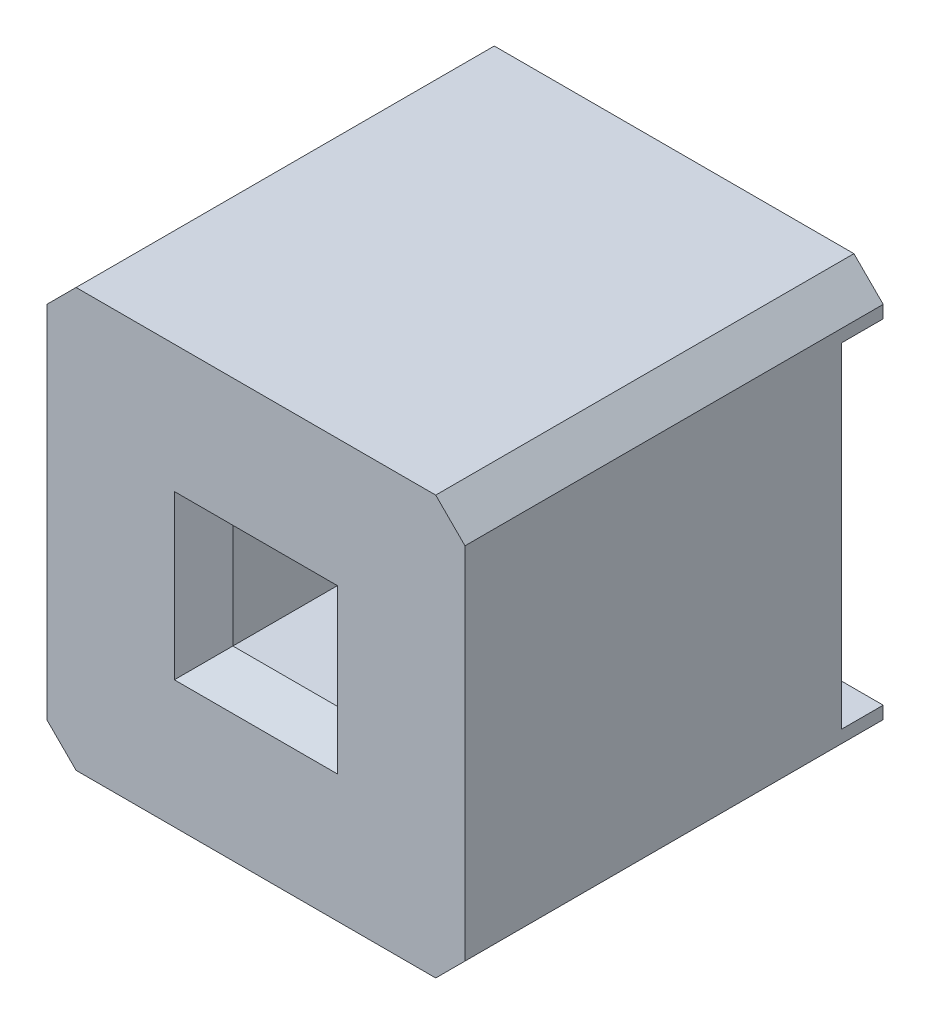
ISO-10303-21;
HEADER;
FILE_DESCRIPTION(('STEP AP214'),'2;1');
FILE_NAME('part.step','',(''),(''),'','','');
FILE_SCHEMA(('AUTOMOTIVE_DESIGN { 1 0 10303 214 1 1 1 1 }'));
ENDSEC;
DATA;
#1=APPLICATION_CONTEXT('core data for automotive mechanical design processes');
#2=APPLICATION_PROTOCOL_DEFINITION('international standard','automotive_design',2000,#1);
#3=PRODUCT_CONTEXT('',#1,'mechanical');
#4=PRODUCT('Part','Part','',(#3));
#5=PRODUCT_RELATED_PRODUCT_CATEGORY('part','',(#4));
#6=PRODUCT_DEFINITION_FORMATION('','',#4);
#7=PRODUCT_DEFINITION_CONTEXT('part definition',#1,'design');
#8=PRODUCT_DEFINITION('design','',#6,#7);
#9=PRODUCT_DEFINITION_SHAPE('','',#8);
#10=(LENGTH_UNIT() NAMED_UNIT(*) SI_UNIT(.MILLI.,.METRE.));
#11=(NAMED_UNIT(*) PLANE_ANGLE_UNIT() SI_UNIT($,.RADIAN.));
#12=(NAMED_UNIT(*) SI_UNIT($,.STERADIAN.) SOLID_ANGLE_UNIT());
#13=UNCERTAINTY_MEASURE_WITH_UNIT(LENGTH_MEASURE(1.E-05),#10,'distance_accuracy_value','');
#14=(GEOMETRIC_REPRESENTATION_CONTEXT(3) GLOBAL_UNCERTAINTY_ASSIGNED_CONTEXT((#13)) GLOBAL_UNIT_ASSIGNED_CONTEXT((#10,
#11,#12)) REPRESENTATION_CONTEXT('',''));
#15=CARTESIAN_POINT('',(0.,0.,0.));
#16=DIRECTION('',(0.,0.,1.));
#17=DIRECTION('',(1.,0.,0.));
#18=AXIS2_PLACEMENT_3D('',#15,#16,#17);
#19=CARTESIAN_POINT('',(63.4364997100133,62.5479954414347,2.30896051788638));
#20=DIRECTION('',(-2.05103367282991E-10,1.,-2.05103428515331E-10));
#21=DIRECTION('',(0.,2.05103428515331E-10,1.));
#22=AXIS2_PLACEMENT_3D('',#19,#20,#21);
#23=PLANE('',#22);
#24=DIRECTION('',(0.,0.,1.));
#25=VECTOR('',#24,1.);
#26=CARTESIAN_POINT('',(63.4364997100133,62.5479954414347,2.30896051801662));
#27=LINE('',#26,#25);
#28=CARTESIAN_POINT('',(63.4364997099546,62.5479954414021,2.30896051791894));
#29=VERTEX_POINT('',#28);
#30=CARTESIAN_POINT('',(63.4364997099245,62.5479954417509,4.41716051787091));
#31=VERTEX_POINT('',#30);
#32=EDGE_CURVE('E170',#29,#31,#27,.T.);
#33=ORIENTED_EDGE('',*,*,#32,.T.);
#34=DIRECTION('',(1.,2.05103367282991E-10,0.));
#35=VECTOR('',#34,1.);
#36=CARTESIAN_POINT('',(63.4364997100133,62.5479954418671,4.41716051788638));
#37=LINE('',#36,#35);
#38=CARTESIAN_POINT('',(62.8014997100426,62.5479954417515,4.41716051791894));
#39=VERTEX_POINT('',#38);
#40=EDGE_CURVE('E20',#39,#31,#37,.T.);
#41=ORIENTED_EDGE('',*,*,#40,.F.);
#42=DIRECTION('',(0.,0.,1.));
#43=VECTOR('',#42,1.);
#44=CARTESIAN_POINT('',(62.8014997100133,62.5479954417368,2.30896051788638));
#45=LINE('',#44,#43);
#46=CARTESIAN_POINT('',(62.8014997100459,62.5479954414125,2.30896051788638));
#47=VERTEX_POINT('',#46);
#48=EDGE_CURVE('E155',#39,#47,#45,.F.);
#49=ORIENTED_EDGE('',*,*,#48,.T.);
#50=DIRECTION('',(1.,2.05103367282991E-10,0.));
#51=VECTOR('',#50,1.);
#52=CARTESIAN_POINT('',(63.4364997100133,62.5479954414347,2.30896051788638));
#53=LINE('',#52,#51);
#54=EDGE_CURVE('E138',#29,#47,#53,.F.);
#55=ORIENTED_EDGE('',*,*,#54,.F.);
#56=EDGE_LOOP('',(#33,#41,#49,#55));
#57=FACE_BOUND('',#56,.T.);
#58=ADVANCED_FACE('F17',(#57),#23,.F.);
#59=CARTESIAN_POINT('',(62.8014997100133,62.5479954413044,2.30896051788638));
#60=DIRECTION('',(-1.,-2.05103367282991E-10,0.));
#61=DIRECTION('',(2.05103367282991E-10,-1.,0.));
#62=AXIS2_PLACEMENT_3D('',#59,#60,#61);
#63=PLANE('',#62);
#64=ORIENTED_EDGE('',*,*,#48,.F.);
#65=DIRECTION('',(2.05103367282991E-10,-1.,0.));
#66=VECTOR('',#65,1.);
#67=CARTESIAN_POINT('',(62.8014997100133,62.5479954413044,4.41716051801662));
#68=LINE('',#67,#66);
#69=CARTESIAN_POINT('',(62.8014997101443,61.9129954415434,4.41716051800847));
#70=VERTEX_POINT('',#69);
#71=EDGE_CURVE('E143',#70,#39,#68,.F.);
#72=ORIENTED_EDGE('',*,*,#71,.F.);
#73=DIRECTION('',(0.,-2.05103428515331E-10,-1.));
#74=VECTOR('',#73,1.);
#75=CARTESIAN_POINT('',(62.8014997101435,61.9129954413044,2.30896051801662));
#76=LINE('',#75,#74);
#77=CARTESIAN_POINT('',(62.8014997101435,61.912995441337,2.3089605179515));
#78=VERTEX_POINT('',#77);
#79=EDGE_CURVE('E194',#70,#78,#76,.T.);
#80=ORIENTED_EDGE('',*,*,#79,.T.);
#81=DIRECTION('',(2.05103367282991E-10,-1.,0.));
#82=VECTOR('',#81,1.);
#83=CARTESIAN_POINT('',(62.8014997100133,62.5479954413044,2.30896051788638));
#84=LINE('',#83,#82);
#85=EDGE_CURVE('E173',#47,#78,#84,.T.);
#86=ORIENTED_EDGE('',*,*,#85,.F.);
#87=EDGE_LOOP('',(#64,#72,#80,#86));
#88=FACE_BOUND('',#87,.T.);
#89=ADVANCED_FACE('F172',(#88),#63,.F.);
#90=CARTESIAN_POINT('',(61.8489997102868,61.214495441057,2.05496051815989));
#91=DIRECTION('',(2.05103367282991E-10,-1.,2.05103428515331E-10));
#92=DIRECTION('',(0.,-2.05103428515331E-10,-1.));
#93=AXIS2_PLACEMENT_3D('',#90,#91,#92);
#94=PLANE('',#93);
#95=DIRECTION('',(0.,-2.05103428515331E-10,-1.));
#96=VECTOR('',#95,1.);
#97=CARTESIAN_POINT('',(64.3889997102868,61.214495441578,2.05496051815989));
#98=LINE('',#97,#96);
#99=CARTESIAN_POINT('',(64.3889997102907,61.2144954416065,2.0549605181677));
#100=VERTEX_POINT('',#99);
#101=CARTESIAN_POINT('',(64.3889997102868,61.2144954415058,2.30896051815989));
#102=VERTEX_POINT('',#101);
#103=EDGE_CURVE('E179',#100,#102,#98,.F.);
#104=ORIENTED_EDGE('',*,*,#103,.F.);
#105=DIRECTION('',(1.,0.,0.));
#106=VECTOR('',#105,1.);
#107=CARTESIAN_POINT('',(64.3889997103389,61.214495441616,2.05496051815988));
#108=LINE('',#107,#106);
#109=CARTESIAN_POINT('',(61.8489997102868,61.2144954412419,2.05496051815989));
#110=VERTEX_POINT('',#109);
#111=EDGE_CURVE('E188',#100,#110,#108,.F.);
#112=ORIENTED_EDGE('',*,*,#111,.T.);
#113=DIRECTION('',(0.,-2.05103428515331E-10,-1.));
#114=VECTOR('',#113,1.);
#115=CARTESIAN_POINT('',(61.8489997102868,61.214495441057,2.05496051815989));
#116=LINE('',#115,#114);
#117=CARTESIAN_POINT('',(61.8489997101826,61.2144954411282,2.3089605180557));
#118=VERTEX_POINT('',#117);
#119=EDGE_CURVE('E175',#118,#110,#116,.T.);
#120=ORIENTED_EDGE('',*,*,#119,.F.);
#121=DIRECTION('',(1.,0.,0.));
#122=VECTOR('',#121,1.);
#123=CARTESIAN_POINT('',(64.3889997102868,61.2144954411472,2.30896051815989));
#124=LINE('',#123,#122);
#125=EDGE_CURVE('E200',#118,#102,#124,.T.);
#126=ORIENTED_EDGE('',*,*,#125,.T.);
#127=EDGE_LOOP('',(#104,#112,#120,#126));
#128=FACE_BOUND('',#127,.T.);
#129=ADVANCED_FACE('F320',(#128),#94,.F.);
#130=CARTESIAN_POINT('',(63.4364997101435,61.9129954414347,2.30896051801662));
#131=DIRECTION('',(1.,2.05103367282991E-10,0.));
#132=DIRECTION('',(-2.05103367282991E-10,1.,0.));
#133=AXIS2_PLACEMENT_3D('',#130,#131,#132);
#134=PLANE('',#133);
#135=DIRECTION('',(0.,-2.05103428515331E-10,-1.));
#136=VECTOR('',#135,1.);
#137=CARTESIAN_POINT('',(63.4364997101435,61.9129954414346,2.30896051801662));
#138=LINE('',#137,#136);
#139=CARTESIAN_POINT('',(63.436499710111,61.9129954415428,2.30896051801662));
#140=VERTEX_POINT('',#139);
#141=CARTESIAN_POINT('',(63.4364997100816,61.9129954418996,4.41716051790427));
#142=VERTEX_POINT('',#141);
#143=EDGE_CURVE('E191',#140,#142,#138,.F.);
#144=ORIENTED_EDGE('',*,*,#143,.T.);
#145=DIRECTION('',(-2.05103367282991E-10,1.,0.));
#146=VECTOR('',#145,1.);
#147=CARTESIAN_POINT('',(63.4364997101435,61.9129954414347,4.41716051788638));
#148=LINE('',#147,#146);
#149=EDGE_CURVE('E182',#31,#142,#148,.F.);
#150=ORIENTED_EDGE('',*,*,#149,.F.);
#151=ORIENTED_EDGE('',*,*,#32,.F.);
#152=DIRECTION('',(0.,-1.,2.05103428515331E-10));
#153=VECTOR('',#152,1.);
#154=CARTESIAN_POINT('',(63.4364997100133,61.21449544163,2.30896051815989));
#155=LINE('',#154,#153);
#156=EDGE_CURVE('E206',#29,#140,#155,.T.);
#157=ORIENTED_EDGE('',*,*,#156,.T.);
#158=EDGE_LOOP('',(#144,#150,#151,#157));
#159=FACE_BOUND('',#158,.T.);
#160=ADVANCED_FACE('F497',(#159),#134,.F.);
#161=CARTESIAN_POINT('',(64.3889997103389,60.9604954415779,2.05496051821198));
#162=DIRECTION('',(0.,2.05103428515331E-10,1.));
#163=DIRECTION('',(0.,-1.,2.05103428515331E-10));
#164=AXIS2_PLACEMENT_3D('',#161,#162,#163);
#165=PLANE('',#164);
#166=DIRECTION('',(0.,-1.,2.05103428515331E-10));
#167=VECTOR('',#166,1.);
#168=CARTESIAN_POINT('',(64.3889997103024,60.9604954415779,2.05496051821198));
#169=LINE('',#168,#167);
#170=CARTESIAN_POINT('',(64.3889997103675,61.1382954417733,2.05496051817552));
#171=VERTEX_POINT('',#170);
#172=EDGE_CURVE('E186',#171,#100,#169,.F.);
#173=ORIENTED_EDGE('',*,*,#172,.F.);
#174=DIRECTION('',(-0.707106781041518,-0.707106781331578,0.));
#175=VECTOR('',#174,1.);
#176=CARTESIAN_POINT('',(64.2111997103389,60.9604954415415,2.05496051817552));
#177=LINE('',#176,#175);
#178=CARTESIAN_POINT('',(64.2111997101149,60.9604954413174,2.05496051820286));
#179=VERTEX_POINT('',#178);
#180=EDGE_CURVE('E196',#171,#179,#177,.T.);
#181=ORIENTED_EDGE('',*,*,#180,.T.);
#182=DIRECTION('',(1.,2.05103367282991E-10,0.));
#183=VECTOR('',#182,1.);
#184=CARTESIAN_POINT('',(62.0267997103389,60.9604954410934,2.05496051821198));
#185=LINE('',#184,#183);
#186=CARTESIAN_POINT('',(62.0267997102087,60.9604954412237,2.05496051821198));
#187=VERTEX_POINT('',#186);
#188=EDGE_CURVE('E217',#187,#179,#185,.T.);
#189=ORIENTED_EDGE('',*,*,#188,.F.);
#190=DIRECTION('',(-0.707106781331578,0.707106781041518,0.));
#191=VECTOR('',#190,1.);
#192=CARTESIAN_POINT('',(61.8489997103024,61.138295441057,2.05496051821198));
#193=LINE('',#192,#191);
#194=CARTESIAN_POINT('',(61.8489997102946,61.1382954410648,2.05496051818072));
#195=VERTEX_POINT('',#194);
#196=EDGE_CURVE('E209',#187,#195,#193,.T.);
#197=ORIENTED_EDGE('',*,*,#196,.T.);
#198=DIRECTION('',(0.,-1.,2.05103428515331E-10));
#199=VECTOR('',#198,1.);
#200=CARTESIAN_POINT('',(61.8489997102868,60.9604954415779,2.05496051821198));
#201=LINE('',#200,#199);
#202=EDGE_CURVE('E184',#110,#195,#201,.T.);
#203=ORIENTED_EDGE('',*,*,#202,.F.);
#204=ORIENTED_EDGE('',*,*,#111,.F.);
#205=EDGE_LOOP('',(#173,#181,#189,#197,#203,#204));
#206=FACE_BOUND('',#205,.T.);
#207=ADVANCED_FACE('F324',(#206),#165,.F.);
#208=CARTESIAN_POINT('',(62.8014997101435,61.9129954413044,2.30896051801662));
#209=DIRECTION('',(2.05103367282991E-10,-1.,2.05103428515331E-10));
#210=DIRECTION('',(0.,-2.05103428515331E-10,-1.));
#211=AXIS2_PLACEMENT_3D('',#208,#209,#210);
#212=PLANE('',#211);
#213=ORIENTED_EDGE('',*,*,#79,.F.);
#214=DIRECTION('',(1.,1.02551683683563E-10,1.02551683641495E-10));
#215=VECTOR('',#214,1.);
#216=CARTESIAN_POINT('',(63.6202433101435,61.9129954418859,4.41716051803542));
#217=LINE('',#216,#215);
#218=EDGE_CURVE('E226',#142,#70,#217,.F.);
#219=ORIENTED_EDGE('',*,*,#218,.F.);
#220=ORIENTED_EDGE('',*,*,#143,.F.);
#221=DIRECTION('',(1.,0.,0.));
#222=VECTOR('',#221,1.);
#223=CARTESIAN_POINT('',(64.3889997102868,61.9129954414347,2.30896051801663));
#224=LINE('',#223,#222);
#225=EDGE_CURVE('E203',#140,#78,#224,.F.);
#226=ORIENTED_EDGE('',*,*,#225,.T.);
#227=EDGE_LOOP('',(#213,#219,#220,#226));
#228=FACE_BOUND('',#227,.T.);
#229=ADVANCED_FACE('F481',(#228),#212,.F.);
#230=CARTESIAN_POINT('',(64.2111997103389,60.9604954415415,2.05496051821198));
#231=DIRECTION('',(-0.707106781331578,0.707106781041518,-1.45030025147801E-10));
#232=DIRECTION('',(-0.707106781041518,-0.707106781331578,0.));
#233=AXIS2_PLACEMENT_3D('',#230,#231,#232);
#234=PLANE('',#233);
#235=DIRECTION('',(-0.707106781041518,-0.707106781331578,0.));
#236=VECTOR('',#235,1.);
#237=CARTESIAN_POINT('',(64.2111997100784,60.960495441802,4.59496051821198));
#238=LINE('',#237,#236);
#239=CARTESIAN_POINT('',(64.2111997100967,60.9604954418202,4.59496051821198));
#240=VERTEX_POINT('',#239);
#241=CARTESIAN_POINT('',(64.3889997103024,61.1382954420989,4.59496051808174));
#242=VERTEX_POINT('',#241);
#243=EDGE_CURVE('E198',#240,#242,#238,.F.);
#244=ORIENTED_EDGE('',*,*,#243,.F.);
#245=DIRECTION('',(0.,-2.05103428515331E-10,-1.));
#246=VECTOR('',#245,1.);
#247=CARTESIAN_POINT('',(64.2111997103389,60.9604954415414,2.05496051821198));
#248=LINE('',#247,#246);
#249=EDGE_CURVE('E165',#179,#240,#248,.F.);
#250=ORIENTED_EDGE('',*,*,#249,.F.);
#251=ORIENTED_EDGE('',*,*,#180,.F.);
#252=DIRECTION('',(0.,0.,1.));
#253=VECTOR('',#252,1.);
#254=CARTESIAN_POINT('',(64.3889997103024,61.1382954420989,2.05496051817552));
#255=LINE('',#254,#253);
#256=EDGE_CURVE('E234',#242,#171,#255,.F.);
#257=ORIENTED_EDGE('',*,*,#256,.F.);
#258=EDGE_LOOP('',(#244,#250,#251,#257));
#259=FACE_BOUND('',#258,.T.);
#260=ADVANCED_FACE('F315',(#259),#234,.F.);
#261=CARTESIAN_POINT('',(64.3889997102868,61.21449544163,2.30896051815989));
#262=DIRECTION('',(0.,2.05103428515331E-10,1.));
#263=DIRECTION('',(0.,-1.,2.05103428515331E-10));
#264=AXIS2_PLACEMENT_3D('',#261,#262,#263);
#265=PLANE('',#264);
#266=ORIENTED_EDGE('',*,*,#54,.T.);
#267=ORIENTED_EDGE('',*,*,#85,.T.);
#268=ORIENTED_EDGE('',*,*,#225,.F.);
#269=ORIENTED_EDGE('',*,*,#156,.F.);
#270=EDGE_LOOP('',(#266,#267,#268,#269));
#271=FACE_BOUND('',#270,.T.);
#272=DIRECTION('',(-2.05103367282991E-10,1.,0.));
#273=VECTOR('',#272,1.);
#274=CARTESIAN_POINT('',(64.3889997103024,61.1382954415779,2.30896051815989));
#275=LINE('',#274,#273);
#276=CARTESIAN_POINT('',(64.3889997100784,63.2464954415728,2.30896051784731));
#277=VERTEX_POINT('',#276);
#278=EDGE_CURVE('E229',#102,#277,#275,.T.);
#279=ORIENTED_EDGE('',*,*,#278,.F.);
#280=ORIENTED_EDGE('',*,*,#125,.F.);
#281=DIRECTION('',(2.05103367282991E-10,-1.,0.));
#282=VECTOR('',#281,1.);
#283=CARTESIAN_POINT('',(61.8489997098544,63.322695441057,2.30896051774312));
#284=LINE('',#283,#282);
#285=CARTESIAN_POINT('',(61.84899970987,63.2464954411882,2.30896051774312));
#286=VERTEX_POINT('',#285);
#287=EDGE_CURVE('E245',#286,#118,#284,.T.);
#288=ORIENTED_EDGE('',*,*,#287,.F.);
#289=DIRECTION('',(1.,2.05103367282991E-10,0.));
#290=VECTOR('',#289,1.);
#291=CARTESIAN_POINT('',(64.38899970987,63.24649544163,2.30896051774312));
#292=LINE('',#291,#290);
#293=EDGE_CURVE('E237',#286,#277,#292,.T.);
#294=ORIENTED_EDGE('',*,*,#293,.T.);
#295=EDGE_LOOP('',(#279,#280,#288,#294));
#296=FACE_BOUND('',#295,.T.);
#297=ADVANCED_FACE('F331',(#271,#296),#265,.F.);
#298=CARTESIAN_POINT('',(61.8489997103024,61.138295441057,2.05496051817552));
#299=DIRECTION('',(0.707106781041518,0.707106781331578,-1.45030025147801E-10));
#300=DIRECTION('',(-0.707106781331578,0.707106781041518,0.));
#301=AXIS2_PLACEMENT_3D('',#298,#299,#300);
#302=PLANE('',#301);
#303=DIRECTION('',(-0.707106781331578,0.707106781041518,0.));
#304=VECTOR('',#303,1.);
#305=CARTESIAN_POINT('',(61.8489997105629,61.1382954413175,4.59496051817552));
#306=LINE('',#305,#304);
#307=CARTESIAN_POINT('',(61.8489997103207,61.1382954414295,4.59496051817552));
#308=VERTEX_POINT('',#307);
#309=CARTESIAN_POINT('',(62.0267997103389,60.9604954416144,4.59496051819375));
#310=VERTEX_POINT('',#309);
#311=EDGE_CURVE('E212',#308,#310,#306,.F.);
#312=ORIENTED_EDGE('',*,*,#311,.F.);
#313=DIRECTION('',(0.,0.,1.));
#314=VECTOR('',#313,1.);
#315=CARTESIAN_POINT('',(61.8489997103024,61.138295441057,2.05496051772749));
#316=LINE('',#315,#314);
#317=EDGE_CURVE('E248',#195,#308,#316,.T.);
#318=ORIENTED_EDGE('',*,*,#317,.F.);
#319=ORIENTED_EDGE('',*,*,#196,.F.);
#320=DIRECTION('',(0.,-2.05103428515331E-10,-1.));
#321=VECTOR('',#320,1.);
#322=CARTESIAN_POINT('',(62.0267997103389,60.9604954410934,2.05496051821198));
#323=LINE('',#322,#321);
#324=EDGE_CURVE('E214',#310,#187,#323,.T.);
#325=ORIENTED_EDGE('',*,*,#324,.F.);
#326=EDGE_LOOP('',(#312,#318,#319,#325));
#327=FACE_BOUND('',#326,.T.);
#328=ADVANCED_FACE('F341',(#327),#302,.F.);
#329=CARTESIAN_POINT('',(62.0267997103389,60.9604954410934,2.05496051821198));
#330=DIRECTION('',(2.05103367282991E-10,-1.,2.05103428515331E-10));
#331=DIRECTION('',(0.,-2.05103428515331E-10,-1.));
#332=AXIS2_PLACEMENT_3D('',#329,#330,#331);
#333=PLANE('',#332);
#334=ORIENTED_EDGE('',*,*,#188,.T.);
#335=ORIENTED_EDGE('',*,*,#249,.T.);
#336=DIRECTION('',(1.,0.,0.));
#337=VECTOR('',#336,1.);
#338=CARTESIAN_POINT('',(64.3889997103389,60.9604954416144,4.59496051821198));
#339=LINE('',#338,#337);
#340=EDGE_CURVE('E254',#310,#240,#339,.T.);
#341=ORIENTED_EDGE('',*,*,#340,.F.);
#342=ORIENTED_EDGE('',*,*,#324,.T.);
#343=EDGE_LOOP('',(#334,#335,#341,#342));
#344=FACE_BOUND('',#343,.T.);
#345=ADVANCED_FACE('F343',(#344),#333,.T.);
#346=CARTESIAN_POINT('',(62.8014997101812,61.7292518417368,4.41716051805431));
#347=DIRECTION('',(0.707106781186547,2.90060006997799E-10,0.707106781186548));
#348=DIRECTION('',(0.707106781186548,0.,-0.707106781186547));
#349=AXIS2_PLACEMENT_3D('',#346,#347,#348);
#350=PLANE('',#349);
#351=DIRECTION('',(0.577350269296001,-0.577350269195644,-0.577350269077233));
#352=VECTOR('',#351,1.);
#353=CARTESIAN_POINT('',(62.6236997100997,62.7257954417368,4.59496051784991));
#354=LINE('',#353,#352);
#355=CARTESIAN_POINT('',(62.6236997100637,62.7257954417622,4.59496051784459));
#356=VERTEX_POINT('',#355);
#357=EDGE_CURVE('E146',#356,#39,#354,.T.);
#358=ORIENTED_EDGE('',*,*,#357,.F.);
#359=DIRECTION('',(0.,-1.,2.05103428515331E-10));
#360=VECTOR('',#359,1.);
#361=CARTESIAN_POINT('',(62.62369971018,60.9604954420989,4.59496051821198));
#362=LINE('',#361,#360);
#363=CARTESIAN_POINT('',(62.6236997102107,61.7351954418951,4.594960518007));
#364=VERTEX_POINT('',#363);
#365=EDGE_CURVE('E260',#364,#356,#362,.F.);
#366=ORIENTED_EDGE('',*,*,#365,.F.);
#367=DIRECTION('',(-0.577350269077211,-0.577350269186626,0.57735026930504));
#368=VECTOR('',#367,1.);
#369=CARTESIAN_POINT('',(62.8014997101435,61.9129954417954,4.41716051795795));
#370=LINE('',#369,#368);
#371=EDGE_CURVE('E149',#70,#364,#370,.T.);
#372=ORIENTED_EDGE('',*,*,#371,.F.);
#373=ORIENTED_EDGE('',*,*,#71,.T.);
#374=EDGE_LOOP('',(#358,#366,#372,#373));
#375=FACE_BOUND('',#374,.T.);
#376=ADVANCED_FACE('F145',(#375),#350,.T.);
#377=CARTESIAN_POINT('',(62.6177561100133,62.5479954416991,4.41716051788638));
#378=DIRECTION('',(1.45029981820252E-10,-0.707106781041517,0.707106781331578));
#379=DIRECTION('',(0.,-0.707106781331578,-0.707106781041517));
#380=AXIS2_PLACEMENT_3D('',#377,#378,#379);
#381=PLANE('',#380);
#382=DIRECTION('',(-0.577350269068248,-0.577350269432364,-0.577350269068265));
#383=VECTOR('',#382,1.);
#384=CARTESIAN_POINT('',(63.6142997099154,62.72579544194,4.59496051778851));
#385=LINE('',#384,#383);
#386=CARTESIAN_POINT('',(63.6142997099202,62.72579544194,4.59496051788537));
#387=VERTEX_POINT('',#386);
#388=EDGE_CURVE('E164',#387,#31,#385,.T.);
#389=ORIENTED_EDGE('',*,*,#388,.F.);
#390=DIRECTION('',(1.,0.,0.));
#391=VECTOR('',#390,1.);
#392=CARTESIAN_POINT('',(64.3889997103389,62.7257954417368,4.59496051784991));
#393=LINE('',#392,#391);
#394=EDGE_CURVE('E162',#356,#387,#393,.T.);
#395=ORIENTED_EDGE('',*,*,#394,.F.);
#396=ORIENTED_EDGE('',*,*,#357,.T.);
#397=ORIENTED_EDGE('',*,*,#40,.T.);
#398=EDGE_LOOP('',(#389,#395,#396,#397));
#399=FACE_BOUND('',#398,.T.);
#400=ADVANCED_FACE('F159',(#399),#381,.T.);
#401=CARTESIAN_POINT('',(63.4364997099756,62.7317390418671,4.4171605178487));
#402=DIRECTION('',(-0.707106781186547,0.,0.707106781186548));
#403=DIRECTION('',(0.707106781186548,0.,0.707106781186547));
#404=AXIS2_PLACEMENT_3D('',#401,#402,#403);
#405=PLANE('',#404);
#406=ORIENTED_EDGE('',*,*,#388,.T.);
#407=ORIENTED_EDGE('',*,*,#149,.T.);
#408=DIRECTION('',(-0.577350269296182,0.577350268958722,-0.577350269313974));
#409=VECTOR('',#408,1.);
#410=CARTESIAN_POINT('',(63.6142997100572,61.73519544194,4.59496051805306));
#411=LINE('',#410,#409);
#412=CARTESIAN_POINT('',(63.6142997100471,61.73519544193,4.59496051803242));
#413=VERTEX_POINT('',#412);
#414=EDGE_CURVE('E223',#413,#142,#411,.T.);
#415=ORIENTED_EDGE('',*,*,#414,.F.);
#416=DIRECTION('',(0.,-1.,2.05103428515331E-10));
#417=VECTOR('',#416,1.);
#418=CARTESIAN_POINT('',(63.614299709854,60.9604954420989,4.59496051821198));
#419=LINE('',#418,#417);
#420=EDGE_CURVE('E263',#387,#413,#419,.T.);
#421=ORIENTED_EDGE('',*,*,#420,.F.);
#422=EDGE_LOOP('',(#406,#407,#415,#421));
#423=FACE_BOUND('',#422,.T.);
#424=ADVANCED_FACE('F376',(#423),#405,.T.);
#425=CARTESIAN_POINT('',(63.6202433101435,61.9129954419047,4.41716051801662));
#426=DIRECTION('',(-1.45029981879744E-10,0.707106781331577,0.707106781041518));
#427=DIRECTION('',(0.,-0.707106781041518,0.707106781331577));
#428=AXIS2_PLACEMENT_3D('',#425,#426,#427);
#429=PLANE('',#428);
#430=ORIENTED_EDGE('',*,*,#371,.T.);
#431=DIRECTION('',(1.,0.,0.));
#432=VECTOR('',#431,1.);
#433=CARTESIAN_POINT('',(64.3889997103389,61.73519544194,4.59496051805309));
#434=LINE('',#433,#432);
#435=EDGE_CURVE('E266',#413,#364,#434,.F.);
#436=ORIENTED_EDGE('',*,*,#435,.F.);
#437=ORIENTED_EDGE('',*,*,#414,.T.);
#438=ORIENTED_EDGE('',*,*,#218,.T.);
#439=EDGE_LOOP('',(#430,#436,#437,#438));
#440=FACE_BOUND('',#439,.T.);
#441=ADVANCED_FACE('F373',(#440),#429,.T.);
#442=CARTESIAN_POINT('',(64.3889997103024,61.1382954415779,2.05496051817552));
#443=DIRECTION('',(1.,2.05103367282991E-10,0.));
#444=DIRECTION('',(-2.05103367282991E-10,1.,0.));
#445=AXIS2_PLACEMENT_3D('',#442,#443,#444);
#446=PLANE('',#445);
#447=ORIENTED_EDGE('',*,*,#256,.T.);
#448=ORIENTED_EDGE('',*,*,#172,.T.);
#449=ORIENTED_EDGE('',*,*,#103,.T.);
#450=ORIENTED_EDGE('',*,*,#278,.T.);
#451=DIRECTION('',(0.,2.05103428515331E-10,1.));
#452=VECTOR('',#451,1.);
#453=CARTESIAN_POINT('',(64.38899970987,63.2464954415779,2.05496051774312));
#454=LINE('',#453,#452);
#455=CARTESIAN_POINT('',(64.38899970987,63.2464954414166,2.05496051774312));
#456=VERTEX_POINT('',#455);
#457=EDGE_CURVE('E239',#277,#456,#454,.F.);
#458=ORIENTED_EDGE('',*,*,#457,.T.);
#459=DIRECTION('',(-2.05103367282991E-10,1.,0.));
#460=VECTOR('',#459,1.);
#461=CARTESIAN_POINT('',(64.3889997103024,61.1382954415779,2.05496051774312));
#462=LINE('',#461,#460);
#463=CARTESIAN_POINT('',(64.3889997098583,63.322695441574,2.05496051772619));
#464=VERTEX_POINT('',#463);
#465=EDGE_CURVE('E232',#456,#464,#462,.T.);
#466=ORIENTED_EDGE('',*,*,#465,.T.);
#467=DIRECTION('',(1.02551714236632E-10,1.02551714278699E-10,1.));
#468=VECTOR('',#467,1.);
#469=CARTESIAN_POINT('',(64.3889997098544,63.3226954415779,2.05496051772749));
#470=LINE('',#469,#468);
#471=CARTESIAN_POINT('',(64.3889997100315,63.3226954416613,4.59496051772749));
#472=VERTEX_POINT('',#471);
#473=EDGE_CURVE('E269',#464,#472,#470,.T.);
#474=ORIENTED_EDGE('',*,*,#473,.T.);
#475=DIRECTION('',(0.,-1.,2.05103428515331E-10));
#476=VECTOR('',#475,1.);
#477=CARTESIAN_POINT('',(64.3889997103024,60.9604954420989,4.59496051821198));
#478=LINE('',#477,#476);
#479=EDGE_CURVE('E257',#242,#472,#478,.F.);
#480=ORIENTED_EDGE('',*,*,#479,.F.);
#481=EDGE_LOOP('',(#447,#448,#449,#450,#458,#466,#474,#480));
#482=FACE_BOUND('',#481,.T.);
#483=ADVANCED_FACE('F307',(#482),#446,.T.);
#484=CARTESIAN_POINT('',(64.38899970987,63.2464954415779,2.05496051774312));
#485=DIRECTION('',(-2.05103367282991E-10,1.,-2.05103428515331E-10));
#486=DIRECTION('',(0.,2.05103428515331E-10,1.));
#487=AXIS2_PLACEMENT_3D('',#484,#485,#486);
#488=PLANE('',#487);
#489=ORIENTED_EDGE('',*,*,#457,.F.);
#490=ORIENTED_EDGE('',*,*,#293,.F.);
#491=DIRECTION('',(0.,0.,1.));
#492=VECTOR('',#491,1.);
#493=CARTESIAN_POINT('',(61.84899970987,63.2464954409808,2.05496051772749));
#494=LINE('',#493,#492);
#495=CARTESIAN_POINT('',(61.8489997098661,63.2464954409998,2.0549605177353));
#496=VERTEX_POINT('',#495);
#497=EDGE_CURVE('E242',#496,#286,#494,.T.);
#498=ORIENTED_EDGE('',*,*,#497,.F.);
#499=DIRECTION('',(1.,0.,0.));
#500=VECTOR('',#499,1.);
#501=CARTESIAN_POINT('',(64.38899970987,63.2464954409808,2.05496051774312));
#502=LINE('',#501,#500);
#503=EDGE_CURVE('E278',#496,#456,#502,.T.);
#504=ORIENTED_EDGE('',*,*,#503,.T.);
#505=EDGE_LOOP('',(#489,#490,#498,#504));
#506=FACE_BOUND('',#505,.T.);
#507=ADVANCED_FACE('F334',(#506),#488,.F.);
#508=CARTESIAN_POINT('',(61.8489997098544,63.322695441057,2.05496051772749));
#509=DIRECTION('',(-1.,-2.05103367282991E-10,0.));
#510=DIRECTION('',(2.05103367282991E-10,-1.,0.));
#511=AXIS2_PLACEMENT_3D('',#508,#509,#510);
#512=PLANE('',#511);
#513=ORIENTED_EDGE('',*,*,#317,.T.);
#514=DIRECTION('',(0.,-1.,2.05103428515331E-10));
#515=VECTOR('',#514,1.);
#516=CARTESIAN_POINT('',(61.8489997098544,60.9604954420989,4.59496051821198));
#517=LINE('',#516,#515);
#518=CARTESIAN_POINT('',(61.8489997098544,63.3226954415779,4.59496051783038));
#519=VERTEX_POINT('',#518);
#520=EDGE_CURVE('E251',#519,#308,#517,.T.);
#521=ORIENTED_EDGE('',*,*,#520,.F.);
#522=DIRECTION('',(-1.02551714278699E-10,1.02551714236632E-10,1.));
#523=VECTOR('',#522,1.);
#524=CARTESIAN_POINT('',(61.8489997101149,63.3226954413174,2.05496051769102));
#525=LINE('',#524,#523);
#526=CARTESIAN_POINT('',(61.8489997099195,63.3226954412523,2.05496051772749));
#527=VERTEX_POINT('',#526);
#528=EDGE_CURVE('E285',#519,#527,#525,.F.);
#529=ORIENTED_EDGE('',*,*,#528,.T.);
#530=DIRECTION('',(0.,-1.,2.05103428515331E-10));
#531=VECTOR('',#530,1.);
#532=CARTESIAN_POINT('',(61.8489997098544,63.2464954415779,2.05496051774312));
#533=LINE('',#532,#531);
#534=EDGE_CURVE('E275',#527,#496,#533,.T.);
#535=ORIENTED_EDGE('',*,*,#534,.T.);
#536=ORIENTED_EDGE('',*,*,#497,.T.);
#537=ORIENTED_EDGE('',*,*,#287,.T.);
#538=ORIENTED_EDGE('',*,*,#119,.T.);
#539=ORIENTED_EDGE('',*,*,#202,.T.);
#540=EDGE_LOOP('',(#513,#521,#529,#535,#536,#537,#538,#539));
#541=FACE_BOUND('',#540,.T.);
#542=ADVANCED_FACE('F328',(#541),#512,.T.);
#543=CARTESIAN_POINT('',(64.3889997103389,60.9604954420989,4.59496051821198));
#544=DIRECTION('',(0.,2.05103428515331E-10,1.));
#545=DIRECTION('',(0.,-1.,2.05103428515331E-10));
#546=AXIS2_PLACEMENT_3D('',#543,#544,#545);
#547=PLANE('',#546);
#548=ORIENTED_EDGE('',*,*,#420,.T.);
#549=ORIENTED_EDGE('',*,*,#435,.T.);
#550=ORIENTED_EDGE('',*,*,#365,.T.);
#551=ORIENTED_EDGE('',*,*,#394,.T.);
#552=EDGE_LOOP('',(#548,#549,#550,#551));
#553=FACE_BOUND('',#552,.T.);
#554=DIRECTION('',(1.,2.05103367282991E-10,0.));
#555=VECTOR('',#554,1.);
#556=CARTESIAN_POINT('',(64.2111997098179,63.5004954420625,4.59496051769102));
#557=LINE('',#556,#555);
#558=CARTESIAN_POINT('',(62.0267997099768,63.5004954417733,4.59496051769102));
#559=VERTEX_POINT('',#558);
#560=CARTESIAN_POINT('',(64.2111997098179,63.5004954420624,4.59496051770014));
#561=VERTEX_POINT('',#560);
#562=EDGE_CURVE('E288',#559,#561,#557,.T.);
#563=ORIENTED_EDGE('',*,*,#562,.F.);
#564=DIRECTION('',(0.707106781041518,0.707106781331578,0.));
#565=VECTOR('',#564,1.);
#566=CARTESIAN_POINT('',(62.0267997095574,63.5004954413539,4.59496051769102));
#567=LINE('',#566,#565);
#568=EDGE_CURVE('E282',#559,#519,#567,.F.);
#569=ORIENTED_EDGE('',*,*,#568,.T.);
#570=ORIENTED_EDGE('',*,*,#520,.T.);
#571=ORIENTED_EDGE('',*,*,#311,.T.);
#572=ORIENTED_EDGE('',*,*,#340,.T.);
#573=ORIENTED_EDGE('',*,*,#243,.T.);
#574=ORIENTED_EDGE('',*,*,#479,.T.);
#575=DIRECTION('',(0.707106781331578,-0.707106781041518,0.));
#576=VECTOR('',#575,1.);
#577=CARTESIAN_POINT('',(64.3889997101149,63.3226954418384,4.59496051772749));
#578=LINE('',#577,#576);
#579=EDGE_CURVE('E271',#472,#561,#578,.F.);
#580=ORIENTED_EDGE('',*,*,#579,.T.);
#581=EDGE_LOOP('',(#563,#569,#570,#571,#572,#573,#574,#580));
#582=FACE_BOUND('',#581,.T.);
#583=ADVANCED_FACE('F309',(#553,#582),#547,.T.);
#584=CARTESIAN_POINT('',(64.3889997098544,63.3226954415779,2.05496051772749));
#585=DIRECTION('',(-0.707106781041518,-0.707106781331578,1.45030025147801E-10));
#586=DIRECTION('',(0.707106781331578,-0.707106781041518,0.));
#587=AXIS2_PLACEMENT_3D('',#584,#585,#586);
#588=PLANE('',#587);
#589=ORIENTED_EDGE('',*,*,#579,.F.);
#590=ORIENTED_EDGE('',*,*,#473,.F.);
#591=DIRECTION('',(-0.707106781331481,0.707106781041614,-1.45029895187893E-10));
#592=VECTOR('',#591,1.);
#593=CARTESIAN_POINT('',(64.3889997098544,63.3226954415779,2.05496051772749));
#594=LINE('',#593,#592);
#595=CARTESIAN_POINT('',(64.2111997096877,63.5004954416717,2.05496051769102));
#596=VERTEX_POINT('',#595);
#597=EDGE_CURVE('E273',#464,#596,#594,.T.);
#598=ORIENTED_EDGE('',*,*,#597,.T.);
#599=DIRECTION('',(0.,2.05103428515331E-10,1.));
#600=VECTOR('',#599,1.);
#601=CARTESIAN_POINT('',(64.2111997098179,63.5004954415415,2.05496051769102));
#602=LINE('',#601,#600);
#603=EDGE_CURVE('E291',#561,#596,#602,.F.);
#604=ORIENTED_EDGE('',*,*,#603,.F.);
#605=EDGE_LOOP('',(#589,#590,#598,#604));
#606=FACE_BOUND('',#605,.T.);
#607=ADVANCED_FACE('F304',(#606),#588,.F.);
#608=CARTESIAN_POINT('',(64.38899970987,63.2464954415779,2.05496051774312));
#609=DIRECTION('',(0.,2.05103428515331E-10,1.));
#610=DIRECTION('',(0.,-1.,2.05103428515331E-10));
#611=AXIS2_PLACEMENT_3D('',#608,#609,#610);
#612=PLANE('',#611);
#613=ORIENTED_EDGE('',*,*,#534,.F.);
#614=DIRECTION('',(0.707106781041518,0.707106781331578,0.));
#615=VECTOR('',#614,1.);
#616=CARTESIAN_POINT('',(62.0267997098179,63.5004954410934,2.05496051772749));
#617=LINE('',#616,#615);
#618=CARTESIAN_POINT('',(62.0267997100419,63.5004954413175,2.05496051770014));
#619=VERTEX_POINT('',#618);
#620=EDGE_CURVE('E35',#527,#619,#617,.T.);
#621=ORIENTED_EDGE('',*,*,#620,.T.);
#622=DIRECTION('',(1.,2.05103367282991E-10,0.));
#623=VECTOR('',#622,1.);
#624=CARTESIAN_POINT('',(64.2111997098179,63.5004954415415,2.05496051769102));
#625=LINE('',#624,#623);
#626=EDGE_CURVE('E26',#596,#619,#625,.F.);
#627=ORIENTED_EDGE('',*,*,#626,.F.);
#628=ORIENTED_EDGE('',*,*,#597,.F.);
#629=ORIENTED_EDGE('',*,*,#465,.F.);
#630=ORIENTED_EDGE('',*,*,#503,.F.);
#631=EDGE_LOOP('',(#613,#621,#627,#628,#629,#630));
#632=FACE_BOUND('',#631,.T.);
#633=ADVANCED_FACE('F299',(#632),#612,.F.);
#634=CARTESIAN_POINT('',(62.0267997098179,63.5004954410934,2.05496051769102));
#635=DIRECTION('',(0.707106781331578,-0.707106781041518,1.45030025147801E-10));
#636=DIRECTION('',(0.707106781041518,0.707106781331578,0.));
#637=AXIS2_PLACEMENT_3D('',#634,#635,#636);
#638=PLANE('',#637);
#639=ORIENTED_EDGE('',*,*,#568,.F.);
#640=DIRECTION('',(0.,2.05103428515331E-10,1.));
#641=VECTOR('',#640,1.);
#642=CARTESIAN_POINT('',(62.0267997098179,63.5004954410935,2.05496051769102));
#643=LINE('',#642,#641);
#644=EDGE_CURVE('E11',#619,#559,#643,.T.);
#645=ORIENTED_EDGE('',*,*,#644,.F.);
#646=ORIENTED_EDGE('',*,*,#620,.F.);
#647=ORIENTED_EDGE('',*,*,#528,.F.);
#648=EDGE_LOOP('',(#639,#645,#646,#647));
#649=FACE_BOUND('',#648,.T.);
#650=ADVANCED_FACE('F338',(#649),#638,.F.);
#651=CARTESIAN_POINT('',(64.2111997098179,63.5004954415415,2.05496051769102));
#652=DIRECTION('',(-2.05103367282991E-10,1.,-2.05103428515331E-10));
#653=DIRECTION('',(0.,2.05103428515331E-10,1.));
#654=AXIS2_PLACEMENT_3D('',#651,#652,#653);
#655=PLANE('',#654);
#656=ORIENTED_EDGE('',*,*,#626,.T.);
#657=ORIENTED_EDGE('',*,*,#644,.T.);
#658=ORIENTED_EDGE('',*,*,#562,.T.);
#659=ORIENTED_EDGE('',*,*,#603,.T.);
#660=EDGE_LOOP('',(#656,#657,#658,#659));
#661=FACE_BOUND('',#660,.T.);
#662=ADVANCED_FACE('F296',(#661),#655,.T.);
#663=CLOSED_SHELL('',(#58,#89,#129,#160,#207,#229,#260,#297,#328,#345,#376,#400,#424,#441,#483,
#507,#542,#583,#607,#633,#650,#662));
#664=MANIFOLD_SOLID_BREP('B1',#663);
#665=ADVANCED_BREP_SHAPE_REPRESENTATION('',(#18,#664),#14);
#666=SHAPE_DEFINITION_REPRESENTATION(#9,#665);
ENDSEC;
END-ISO-10303-21;
